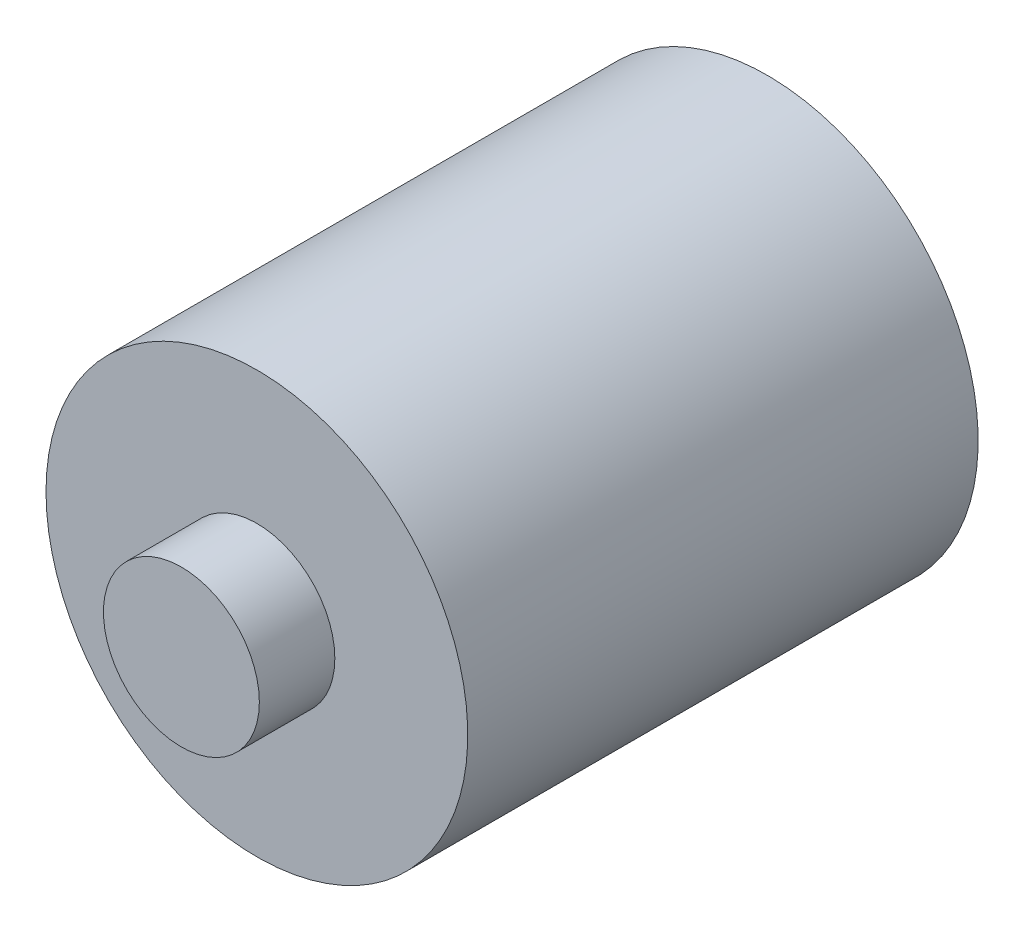
ISO-10303-21;
HEADER;
FILE_DESCRIPTION(('STEP AP214'),'2;1');
FILE_NAME('part.step','',(''),(''),'','','');
FILE_SCHEMA(('AUTOMOTIVE_DESIGN { 1 0 10303 214 1 1 1 1 }'));
ENDSEC;
DATA;
#1=APPLICATION_CONTEXT('core data for automotive mechanical design processes');
#2=APPLICATION_PROTOCOL_DEFINITION('international standard','automotive_design',2000,#1);
#3=PRODUCT_CONTEXT('',#1,'mechanical');
#4=PRODUCT('Part','Part','',(#3));
#5=PRODUCT_RELATED_PRODUCT_CATEGORY('part','',(#4));
#6=PRODUCT_DEFINITION_FORMATION('','',#4);
#7=PRODUCT_DEFINITION_CONTEXT('part definition',#1,'design');
#8=PRODUCT_DEFINITION('design','',#6,#7);
#9=PRODUCT_DEFINITION_SHAPE('','',#8);
#10=(LENGTH_UNIT() NAMED_UNIT(*) SI_UNIT(.MILLI.,.METRE.));
#11=(NAMED_UNIT(*) PLANE_ANGLE_UNIT() SI_UNIT($,.RADIAN.));
#12=(NAMED_UNIT(*) SI_UNIT($,.STERADIAN.) SOLID_ANGLE_UNIT());
#13=UNCERTAINTY_MEASURE_WITH_UNIT(LENGTH_MEASURE(1.E-05),#10,'distance_accuracy_value','');
#14=(GEOMETRIC_REPRESENTATION_CONTEXT(3) GLOBAL_UNCERTAINTY_ASSIGNED_CONTEXT((#13)) GLOBAL_UNIT_ASSIGNED_CONTEXT((#10,
#11,#12)) REPRESENTATION_CONTEXT('',''));
#15=CARTESIAN_POINT('',(0.,0.,0.));
#16=DIRECTION('',(0.,0.,1.));
#17=DIRECTION('',(1.,0.,0.));
#18=AXIS2_PLACEMENT_3D('',#15,#16,#17);
#19=CARTESIAN_POINT('',(0.,0.,31.1));
#20=DIRECTION('',(0.,0.,1.));
#21=DIRECTION('',(1.,0.,0.));
#22=AXIS2_PLACEMENT_3D('',#19,#20,#21);
#23=PLANE('',#22);
#24=CARTESIAN_POINT('',(0.,0.,31.1));
#25=DIRECTION('',(0.,0.,1.));
#26=DIRECTION('',(1.,0.,0.));
#27=AXIS2_PLACEMENT_3D('',#24,#25,#26);
#28=CIRCLE('',#27,12.85);
#29=CARTESIAN_POINT('',(-12.85,0.,31.1));
#30=VERTEX_POINT('',#29);
#31=EDGE_CURVE('E10',#30,#30,#28,.T.);
#32=ORIENTED_EDGE('',*,*,#31,.T.);
#33=EDGE_LOOP('',(#32));
#34=FACE_BOUND('',#33,.T.);
#35=CARTESIAN_POINT('',(0.,0.,31.1));
#36=DIRECTION('',(0.,0.,1.));
#37=DIRECTION('',(1.,0.,0.));
#38=AXIS2_PLACEMENT_3D('',#35,#36,#37);
#39=CIRCLE('',#38,4.75);
#40=CARTESIAN_POINT('',(4.75,0.,31.1));
#41=VERTEX_POINT('',#40);
#42=EDGE_CURVE('E42',#41,#41,#39,.T.);
#43=ORIENTED_EDGE('',*,*,#42,.F.);
#44=EDGE_LOOP('',(#43));
#45=FACE_BOUND('',#44,.T.);
#46=ADVANCED_FACE('F29',(#34,#45),#23,.T.);
#47=CARTESIAN_POINT('',(0.,0.,31.1));
#48=DIRECTION('',(0.,0.,-1.));
#49=DIRECTION('',(-1.,0.,0.));
#50=AXIS2_PLACEMENT_3D('',#47,#48,#49);
#51=CYLINDRICAL_SURFACE('',#50,12.85);
#52=CARTESIAN_POINT('',(0.,0.,0.));
#53=DIRECTION('',(0.,0.,1.));
#54=DIRECTION('',(1.,0.,0.));
#55=AXIS2_PLACEMENT_3D('',#52,#53,#54);
#56=CIRCLE('',#55,12.85);
#57=CARTESIAN_POINT('',(-12.85,0.,0.));
#58=VERTEX_POINT('',#57);
#59=EDGE_CURVE('E33',#58,#58,#56,.T.);
#60=CARTESIAN_POINT('',(-12.85,0.,31.1));
#61=CARTESIAN_POINT('',(-12.85,0.,30.7760416666667));
#62=CARTESIAN_POINT('',(-12.85,0.,30.4520833333333));
#63=CARTESIAN_POINT('',(-12.85,0.,29.8041666666667));
#64=CARTESIAN_POINT('',(-12.85,0.,29.4802083333333));
#65=CARTESIAN_POINT('',(-12.85,0.,28.8322916666667));
#66=CARTESIAN_POINT('',(-12.85,0.,28.5083333333333));
#67=CARTESIAN_POINT('',(-12.85,0.,27.8604166666667));
#68=CARTESIAN_POINT('',(-12.85,0.,27.5364583333333));
#69=CARTESIAN_POINT('',(-12.85,0.,26.8885416666667));
#70=CARTESIAN_POINT('',(-12.85,0.,26.5645833333333));
#71=CARTESIAN_POINT('',(-12.85,0.,25.9166666666667));
#72=CARTESIAN_POINT('',(-12.85,0.,25.5927083333333));
#73=CARTESIAN_POINT('',(-12.85,0.,24.9447916666667));
#74=CARTESIAN_POINT('',(-12.85,0.,24.6208333333333));
#75=CARTESIAN_POINT('',(-12.85,0.,23.9729166666667));
#76=CARTESIAN_POINT('',(-12.85,0.,23.6489583333333));
#77=CARTESIAN_POINT('',(-12.85,0.,23.0010416666667));
#78=CARTESIAN_POINT('',(-12.85,0.,22.6770833333333));
#79=CARTESIAN_POINT('',(-12.85,0.,22.0291666666667));
#80=CARTESIAN_POINT('',(-12.85,0.,21.7052083333333));
#81=CARTESIAN_POINT('',(-12.85,0.,21.0572916666667));
#82=CARTESIAN_POINT('',(-12.85,0.,20.7333333333333));
#83=CARTESIAN_POINT('',(-12.85,0.,20.0854166666667));
#84=CARTESIAN_POINT('',(-12.85,0.,19.7614583333333));
#85=CARTESIAN_POINT('',(-12.85,0.,19.1135416666667));
#86=CARTESIAN_POINT('',(-12.85,0.,18.7895833333333));
#87=CARTESIAN_POINT('',(-12.85,0.,18.1416666666667));
#88=CARTESIAN_POINT('',(-12.85,0.,17.8177083333333));
#89=CARTESIAN_POINT('',(-12.85,0.,17.1697916666667));
#90=CARTESIAN_POINT('',(-12.85,0.,16.8458333333333));
#91=CARTESIAN_POINT('',(-12.85,0.,16.1979166666667));
#92=CARTESIAN_POINT('',(-12.85,0.,15.8739583333333));
#93=CARTESIAN_POINT('',(-12.85,0.,15.2260416666667));
#94=CARTESIAN_POINT('',(-12.85,0.,14.9020833333333));
#95=CARTESIAN_POINT('',(-12.85,0.,14.2541666666667));
#96=CARTESIAN_POINT('',(-12.85,0.,13.9302083333333));
#97=CARTESIAN_POINT('',(-12.85,0.,13.2822916666667));
#98=CARTESIAN_POINT('',(-12.85,0.,12.9583333333333));
#99=CARTESIAN_POINT('',(-12.85,0.,12.3104166666667));
#100=CARTESIAN_POINT('',(-12.85,0.,11.9864583333333));
#101=CARTESIAN_POINT('',(-12.85,0.,11.3385416666667));
#102=CARTESIAN_POINT('',(-12.85,0.,11.0145833333333));
#103=CARTESIAN_POINT('',(-12.85,0.,10.3666666666667));
#104=CARTESIAN_POINT('',(-12.85,0.,10.0427083333333));
#105=CARTESIAN_POINT('',(-12.85,0.,9.39479166666666));
#106=CARTESIAN_POINT('',(-12.85,0.,9.07083333333333));
#107=CARTESIAN_POINT('',(-12.85,0.,8.42291666666667));
#108=CARTESIAN_POINT('',(-12.85,0.,8.09895833333333));
#109=CARTESIAN_POINT('',(-12.85,0.,7.45104166666667));
#110=CARTESIAN_POINT('',(-12.85,0.,7.12708333333333));
#111=CARTESIAN_POINT('',(-12.85,0.,6.47916666666667));
#112=CARTESIAN_POINT('',(-12.85,0.,6.15520833333333));
#113=CARTESIAN_POINT('',(-12.85,0.,5.50729166666667));
#114=CARTESIAN_POINT('',(-12.85,0.,5.18333333333333));
#115=CARTESIAN_POINT('',(-12.85,0.,4.53541666666667));
#116=CARTESIAN_POINT('',(-12.85,0.,4.21145833333333));
#117=CARTESIAN_POINT('',(-12.85,0.,3.56354166666667));
#118=CARTESIAN_POINT('',(-12.85,0.,3.23958333333333));
#119=CARTESIAN_POINT('',(-12.85,0.,2.59166666666667));
#120=CARTESIAN_POINT('',(-12.85,0.,2.26770833333333));
#121=CARTESIAN_POINT('',(-12.85,0.,1.61979166666666));
#122=CARTESIAN_POINT('',(-12.85,0.,1.29583333333333));
#123=CARTESIAN_POINT('',(-12.85,0.,0.647916666666664));
#124=CARTESIAN_POINT('',(-12.85,0.,0.32395833333333));
#125=CARTESIAN_POINT('',(-12.85,0.,0.));
#126=B_SPLINE_CURVE_WITH_KNOTS('',3,(#60,#61,#62,#63,#64,#65,#66,#67,#68,#69,#70,#71,#72,#73,
#74,#75,#76,#77,#78,#79,#80,#81,#82,#83,#84,#85,#86,#87,#88,#89,#90,#91,#92,#93,#94,#95,#96,#97,
#98,#99,#100,#101,#102,#103,#104,#105,#106,#107,#108,#109,#110,#111,#112,#113,#114,#115,#116,
#117,#118,#119,#120,#121,#122,#123,#124,#125),.UNSPECIFIED.,.F.,.F.,(4,2,2,2,2,2,2,2,2,2,2,2,2,
2,2,2,2,2,2,2,2,2,2,2,2,2,2,2,2,2,2,2,4),(0.,0.971875,1.94375,2.915625,3.8875,4.859375,5.83125,
6.803125,7.775,8.746875,9.71875000000001,10.690625,11.6625,12.634375,13.60625,14.578125,15.55,
16.521875,17.49375,18.465625,19.4375,20.409375,21.38125,22.353125,23.325,24.296875,25.26875,
26.240625,27.2125,28.184375,29.15625,30.128125,31.1),.UNSPECIFIED.);
#127=EDGE_CURVE('BSEAM31',#30,#58,#126,.T.);
#128=ORIENTED_EDGE('',*,*,#31,.F.);
#129=ORIENTED_EDGE('',*,*,#59,.T.);
#130=ORIENTED_EDGE('',*,*,#127,.T.);
#131=ORIENTED_EDGE('',*,*,#127,.F.);
#132=EDGE_LOOP('',(#128,#130,#129,#131));
#133=FACE_BOUND('',#132,.T.);
#134=ADVANCED_FACE('F31',(#133),#51,.T.);
#135=CARTESIAN_POINT('',(0.,0.,0.));
#136=DIRECTION('',(0.,0.,1.));
#137=DIRECTION('',(1.,0.,0.));
#138=AXIS2_PLACEMENT_3D('',#135,#136,#137);
#139=PLANE('',#138);
#140=CARTESIAN_POINT('',(0.,0.,0.));
#141=DIRECTION('',(0.,0.,-1.));
#142=DIRECTION('',(-1.,0.,0.));
#143=AXIS2_PLACEMENT_3D('',#140,#141,#142);
#144=CIRCLE('',#143,6.);
#145=CARTESIAN_POINT('',(-6.,0.,0.));
#146=VERTEX_POINT('',#145);
#147=EDGE_CURVE('E48',#146,#146,#144,.T.);
#148=ORIENTED_EDGE('',*,*,#147,.F.);
#149=EDGE_LOOP('',(#148));
#150=FACE_BOUND('',#149,.T.);
#151=ORIENTED_EDGE('',*,*,#59,.F.);
#152=EDGE_LOOP('',(#151));
#153=FACE_BOUND('',#152,.T.);
#154=ADVANCED_FACE('F63',(#150,#153),#139,.F.);
#155=CARTESIAN_POINT('',(0.,0.,35.7));
#156=DIRECTION('',(0.,0.,-1.));
#157=DIRECTION('',(-1.,0.,0.));
#158=AXIS2_PLACEMENT_3D('',#155,#156,#157);
#159=CYLINDRICAL_SURFACE('',#158,4.75);
#160=CARTESIAN_POINT('',(0.,0.,35.7));
#161=DIRECTION('',(0.,0.,1.));
#162=DIRECTION('',(1.,0.,0.));
#163=AXIS2_PLACEMENT_3D('',#160,#161,#162);
#164=CIRCLE('',#163,4.75);
#165=CARTESIAN_POINT('',(4.75,0.,35.7));
#166=VERTEX_POINT('',#165);
#167=EDGE_CURVE('E40',#166,#166,#164,.T.);
#168=ORIENTED_EDGE('',*,*,#167,.F.);
#169=EDGE_LOOP('',(#168));
#170=FACE_BOUND('',#169,.T.);
#171=ORIENTED_EDGE('',*,*,#42,.T.);
#172=EDGE_LOOP('',(#171));
#173=FACE_BOUND('',#172,.T.);
#174=ADVANCED_FACE('F66',(#170,#173),#159,.T.);
#175=CARTESIAN_POINT('',(0.,0.,35.7));
#176=DIRECTION('',(0.,0.,1.));
#177=DIRECTION('',(1.,0.,0.));
#178=AXIS2_PLACEMENT_3D('',#175,#176,#177);
#179=PLANE('',#178);
#180=ORIENTED_EDGE('',*,*,#167,.T.);
#181=EDGE_LOOP('',(#180));
#182=FACE_BOUND('',#181,.T.);
#183=ADVANCED_FACE('F59',(#182),#179,.T.);
#184=CARTESIAN_POINT('',(0.,0.,16.));
#185=DIRECTION('',(0.,0.,-1.));
#186=DIRECTION('',(-1.,0.,0.));
#187=AXIS2_PLACEMENT_3D('',#184,#185,#186);
#188=CYLINDRICAL_SURFACE('',#187,6.);
#189=CARTESIAN_POINT('',(0.,0.,16.));
#190=DIRECTION('',(0.,0.,-1.));
#191=DIRECTION('',(-1.,0.,0.));
#192=AXIS2_PLACEMENT_3D('',#189,#190,#191);
#193=CIRCLE('',#192,6.);
#194=CARTESIAN_POINT('',(-6.,0.,16.));
#195=VERTEX_POINT('',#194);
#196=EDGE_CURVE('E45',#195,#195,#193,.T.);
#197=ORIENTED_EDGE('',*,*,#196,.F.);
#198=EDGE_LOOP('',(#197));
#199=FACE_BOUND('',#198,.T.);
#200=ORIENTED_EDGE('',*,*,#147,.T.);
#201=EDGE_LOOP('',(#200));
#202=FACE_BOUND('',#201,.T.);
#203=ADVANCED_FACE('F56',(#199,#202),#188,.F.);
#204=CARTESIAN_POINT('',(0.,0.,16.));
#205=DIRECTION('',(0.,0.,-1.));
#206=DIRECTION('',(-1.,0.,0.));
#207=AXIS2_PLACEMENT_3D('',#204,#205,#206);
#208=PLANE('',#207);
#209=ORIENTED_EDGE('',*,*,#196,.T.);
#210=EDGE_LOOP('',(#209));
#211=FACE_BOUND('',#210,.T.);
#212=ADVANCED_FACE('F54',(#211),#208,.T.);
#213=CLOSED_SHELL('',(#46,#134,#154,#174,#183,#203,#212));
#214=MANIFOLD_SOLID_BREP('B2',#213);
#215=ADVANCED_BREP_SHAPE_REPRESENTATION('',(#18,#214),#14);
#216=SHAPE_DEFINITION_REPRESENTATION(#9,#215);
ENDSEC;
END-ISO-10303-21;
